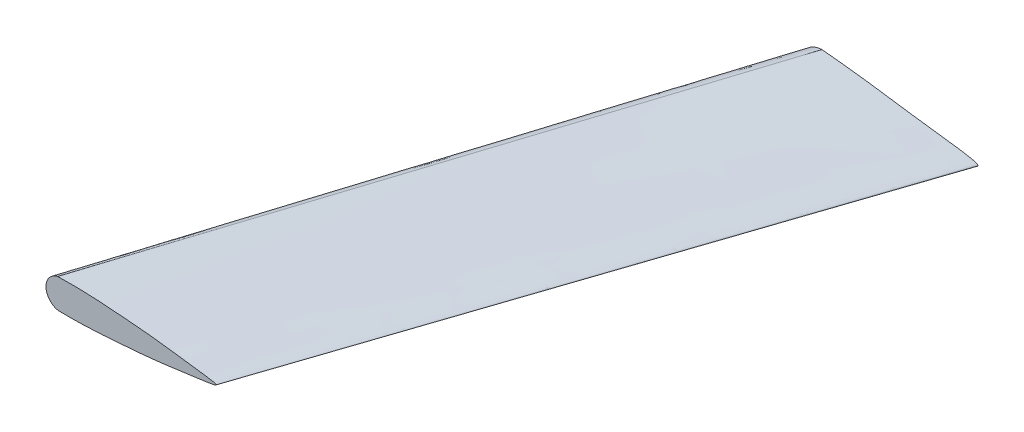
ISO-10303-21;
HEADER;
FILE_DESCRIPTION(('STEP AP214'),'2;1');
FILE_NAME('part.step','',(''),(''),'','','');
FILE_SCHEMA(('AUTOMOTIVE_DESIGN { 1 0 10303 214 1 1 1 1 }'));
ENDSEC;
DATA;
#1=APPLICATION_CONTEXT('core data for automotive mechanical design processes');
#2=APPLICATION_PROTOCOL_DEFINITION('international standard','automotive_design',2000,#1);
#3=PRODUCT_CONTEXT('',#1,'mechanical');
#4=PRODUCT('Part','Part','',(#3));
#5=PRODUCT_RELATED_PRODUCT_CATEGORY('part','',(#4));
#6=PRODUCT_DEFINITION_FORMATION('','',#4);
#7=PRODUCT_DEFINITION_CONTEXT('part definition',#1,'design');
#8=PRODUCT_DEFINITION('design','',#6,#7);
#9=PRODUCT_DEFINITION_SHAPE('','',#8);
#10=(LENGTH_UNIT() NAMED_UNIT(*) SI_UNIT(.MILLI.,.METRE.));
#11=(NAMED_UNIT(*) PLANE_ANGLE_UNIT() SI_UNIT($,.RADIAN.));
#12=(NAMED_UNIT(*) SI_UNIT($,.STERADIAN.) SOLID_ANGLE_UNIT());
#13=UNCERTAINTY_MEASURE_WITH_UNIT(LENGTH_MEASURE(1.E-05),#10,'distance_accuracy_value','');
#14=(GEOMETRIC_REPRESENTATION_CONTEXT(3) GLOBAL_UNCERTAINTY_ASSIGNED_CONTEXT((#13)) GLOBAL_UNIT_ASSIGNED_CONTEXT((#10,
#11,#12)) REPRESENTATION_CONTEXT('',''));
#15=CARTESIAN_POINT('',(0.,0.,0.));
#16=DIRECTION('',(0.,0.,1.));
#17=DIRECTION('',(1.,0.,0.));
#18=AXIS2_PLACEMENT_3D('',#15,#16,#17);
#19=CARTESIAN_POINT('',(-386.17135008712,24.2268414892815,766.353171626567));
#20=DIRECTION('',(0.,0.,1.));
#21=DIRECTION('',(1.,0.,0.));
#22=AXIS2_PLACEMENT_3D('',#19,#20,#21);
#23=PLANE('',#22);
#24=CARTESIAN_POINT('',(-355.842308478358,-13.5919026387807,766.353171626567));
#25=CARTESIAN_POINT('',(-358.147920916067,-13.0809082161954,766.353171626567));
#26=CARTESIAN_POINT('',(-362.799253796191,-11.5850758564931,766.353171626567));
#27=CARTESIAN_POINT('',(-368.126623336941,-8.6822798335398,766.353171626567));
#28=CARTESIAN_POINT('',(-372.108209031717,-5.70325993693681,766.353171626567));
#29=CARTESIAN_POINT('',(-374.862376744892,-3.19928868976864,766.353171626567));
#30=CARTESIAN_POINT('',(-377.366618804863,-0.44493632139839,766.353171626567));
#31=CARTESIAN_POINT('',(-379.600470197875,2.54116834156817,766.353171626567));
#32=CARTESIAN_POINT('',(-381.544903254115,5.73705852469849,766.353171626567));
#33=CARTESIAN_POINT('',(-383.180113713941,9.12813683828008,766.353171626567));
#34=CARTESIAN_POINT('',(-384.486712481758,12.6855603817283,766.353171626567));
#35=CARTESIAN_POINT('',(-385.445090832709,16.4062629041933,766.353171626567));
#36=CARTESIAN_POINT('',(-386.035753835176,20.2425914517185,766.353171626567));
#37=CARTESIAN_POINT('',(-386.239148218191,24.2268440568608,766.353171626567));
#38=CARTESIAN_POINT('',(-386.035753814777,28.2110967078324,766.353171626567));
#39=CARTESIAN_POINT('',(-385.445090884173,32.0474251889436,766.353171626567));
#40=CARTESIAN_POINT('',(-384.486712355592,35.768127842187,766.353171626567));
#41=CARTESIAN_POINT('',(-383.180113968863,39.3255511215188,766.353171626567));
#42=CARTESIAN_POINT('',(-381.544902768267,42.7166299394183,766.353171626567));
#43=CARTESIAN_POINT('',(-379.60047110225,45.91251918088,766.353171626567));
#44=CARTESIAN_POINT('',(-377.366617186236,48.8986255503425,766.353171626567));
#45=CARTESIAN_POINT('',(-374.862379166617,51.6529751869416,766.353171626567));
#46=CARTESIAN_POINT('',(-372.108209401964,54.1569478219396,766.353171626567));
#47=CARTESIAN_POINT('',(-368.126573732497,57.136001490939,766.353171626567));
#48=CARTESIAN_POINT('',(-362.799280092021,60.0387464062484,766.353171626567));
#49=CARTESIAN_POINT('',(-358.147927408527,61.5345930722951,766.353171626567));
#50=CARTESIAN_POINT('',(-355.842312196727,62.0455904675081,766.353171626567));
#51=B_SPLINE_CURVE_WITH_KNOTS('',3,(#24,#25,#26,#27,#28,#29,#30,#31,#32,#33,#34,#35,#36,#37,#38,
#39,#40,#41,#42,#43,#44,#45,#46,#47,#48,#49,#50),.UNSPECIFIED.,.F.,.F.,(4,1,1,1,1,1,1,1,1,1,1,1,
1,1,1,1,1,1,1,1,1,1,1,1,4),(0.0675033234996887,0.125,0.1875,0.21875,0.25,0.28125,0.3125,0.34375,
0.375,0.40625,0.4375,0.46875,0.5,0.53125,0.5625,0.59375,0.625,0.65625,0.6875,0.71875,0.75,
0.78125,0.8125,0.875,0.932496636103502),.UNSPECIFIED.);
#52=CARTESIAN_POINT('',(-355.842309230463,-13.591902326263,766.353171626567));
#53=VERTEX_POINT('',#52);
#54=CARTESIAN_POINT('',(-355.842312196727,62.0455904675081,766.353171626567));
#55=VERTEX_POINT('',#54);
#56=EDGE_CURVE('E71',#53,#55,#51,.T.);
#57=ORIENTED_EDGE('',*,*,#56,.F.);
#58=CARTESIAN_POINT('',(-355.842312196727,62.0455904675081,766.353171626567));
#59=CARTESIAN_POINT('',(-353.297481143165,62.1234537250533,766.353171626567));
#60=CARTESIAN_POINT('',(-331.895982275564,62.6908030841018,766.353171626567));
#61=CARTESIAN_POINT('',(-310.135971955694,62.5426455831257,766.353171626567));
#62=CARTESIAN_POINT('',(-272.083970484117,61.3961570997766,766.353171626568));
#63=CARTESIAN_POINT('',(-252.554697808675,60.353018714265,766.353171626568));
#64=CARTESIAN_POINT('',(-214.450855824515,57.8523002404734,766.353171626568));
#65=CARTESIAN_POINT('',(-194.838246279998,56.329737945447,766.353171626568));
#66=CARTESIAN_POINT('',(-156.959669835358,53.2468514511438,766.353171626568));
#67=CARTESIAN_POINT('',(-137.665791758024,51.6047157251566,766.353171626568));
#68=CARTESIAN_POINT('',(-98.9032615648933,47.6178447133553,766.353171626568));
#69=CARTESIAN_POINT('',(-78.3731384454902,45.1575816166672,766.353171626568));
#70=CARTESIAN_POINT('',(-42.9305350650487,40.2587091098047,766.353171626568));
#71=CARTESIAN_POINT('',(-27.0957667285709,37.692047097939,766.353171626568));
#72=CARTESIAN_POINT('',(20.8463634559503,31.6065898938472,766.353171626568));
#73=CARTESIAN_POINT('',(54.4472084766871,27.9100493798003,766.353171626568));
#74=CARTESIAN_POINT('',(55.3479610458814,20.6930341506973,766.353171626568));
#75=CARTESIAN_POINT('',(22.0865399761721,16.9887896595361,766.353171626568));
#76=CARTESIAN_POINT('',(-26.3334339596562,10.8734004836462,766.353171626568));
#77=CARTESIAN_POINT('',(-42.2572408418296,8.29844257218873,766.353171626568));
#78=CARTESIAN_POINT('',(-77.570779358455,3.3970582268412,766.353171626568));
#79=CARTESIAN_POINT('',(-98.0759664627907,0.930501027220816,766.353171626568));
#80=CARTESIAN_POINT('',(-136.870639280538,-3.07839043210632,766.353171626568));
#81=CARTESIAN_POINT('',(-156.17030993408,-4.72695871670605,766.353171626568));
#82=CARTESIAN_POINT('',(-194.039580846522,-7.8129243350639,766.353171626568));
#83=CARTESIAN_POINT('',(-213.650182655864,-9.3395689758605,766.353171626568));
#84=CARTESIAN_POINT('',(-251.755504762222,-11.8530979206023,766.353171626568));
#85=CARTESIAN_POINT('',(-271.284757505092,-12.9058291803733,766.353171626568));
#86=CARTESIAN_POINT('',(-309.33530982959,-14.0768612861094,766.353171626567));
#87=CARTESIAN_POINT('',(-328.894786935377,-14.2244630585918,766.353171626567));
#88=CARTESIAN_POINT('',(-350.564748997106,-13.7422435150846,766.353171626567));
#89=CARTESIAN_POINT('',(-353.37672316315,-13.6673409378978,766.353171626567));
#90=CARTESIAN_POINT('',(-355.842309230463,-13.591902326263,766.353171626567));
#91=B_SPLINE_CURVE_WITH_KNOTS('',3,(#58,#59,#60,#61,#62,#63,#64,#65,#66,#67,#68,#69,#70,#71,#72,
#73,#74,#75,#76,#77,#78,#79,#80,#81,#82,#83,#84,#85,#86,#87,#88,#89,#90),.UNSPECIFIED.,.F.,.F.,
(4,1,1,1,1,1,1,1,1,1,1,1,1,1,1,1,1,1,1,1,1,1,1,1,1,1,1,1,1,1,4),(0.147230760804553,
0.153748711982093,0.202038514845157,0.202924962495472,0.251275629360019,0.252162033516698,
0.300589425301991,0.301475790959182,0.349963868423673,0.350850410363611,0.399492351086492,
0.400378840750798,0.449147617509877,0.450034058565626,0.499113596493106,0.5,0.549079575476335,
0.549965941434374,0.59873484189972,0.599621159249202,0.64826332456254,0.64914958963639,
0.697637767684222,0.698524209040818,0.746951563626193,0.747837966483302,0.796188678141055,
0.797075037504528,0.845364976114569,0.846251288017907,0.852566272891533),.UNSPECIFIED.);
#92=EDGE_CURVE('E12',#55,#53,#91,.T.);
#93=ORIENTED_EDGE('',*,*,#92,.F.);
#94=EDGE_LOOP('',(#57,#93));
#95=FACE_BOUND('',#94,.T.);
#96=ADVANCED_FACE('F61',(#95),#23,.T.);
#97=CARTESIAN_POINT('',(89.9976521512201,24.226967560186,-713.584473013432));
#98=DIRECTION('',(0.,0.,-1.));
#99=DIRECTION('',(-1.,0.,0.));
#100=AXIS2_PLACEMENT_3D('',#97,#98,#99);
#101=PLANE('',#100);
#102=CARTESIAN_POINT('',(146.235776469784,82.6061359469882,-713.584473013432));
#103=CARTESIAN_POINT('',(144.460889129259,82.5398294956927,-713.584473013432));
#104=CARTESIAN_POINT('',(142.691498804594,82.3655444691674,-713.584473013432));
#105=CARTESIAN_POINT('',(139.834832413366,82.0841627012055,-713.584473013432));
#106=CARTESIAN_POINT('',(137.020482671301,81.5243286915221,-713.584473013432));
#107=CARTESIAN_POINT('',(134.205127570774,80.9642946946621,-713.584473013432));
#108=CARTESIAN_POINT('',(131.459227595661,80.1313068136255,-713.584473013432));
#109=CARTESIAN_POINT('',(128.712298972757,79.2980068851178,-713.584473013432));
#110=CARTESIAN_POINT('',(126.061291504144,78.1998943976652,-713.584473013432));
#111=CARTESIAN_POINT('',(123.409267769514,77.1013609478364,-713.584473013432));
#112=CARTESIAN_POINT('',(120.878659472122,75.7486920010241,-713.584473013432));
#113=CARTESIAN_POINT('',(118.347081064385,74.3955045076862,-713.584473013432));
#114=CARTESIAN_POINT('',(115.96124307918,72.8013060427455,-713.584473013432));
#115=CARTESIAN_POINT('',(113.574490481725,71.2064964409822,-713.584473013432));
#116=CARTESIAN_POINT('',(111.356399733315,69.3861214608127,-713.584473013432));
#117=CARTESIAN_POINT('',(109.137458678272,67.5650486386274,-713.584473013432));
#118=CARTESIAN_POINT('',(107.10847659321,65.5360283496795,-713.584473013432));
#119=CARTESIAN_POINT('',(105.078734414158,63.506247952429,-713.584473013432));
#120=CARTESIAN_POINT('',(103.258383480857,61.288105210681,-713.584473013432));
#121=CARTESIAN_POINT('',(101.437382261364,59.0691700790873,-713.584473013432));
#122=CARTESIAN_POINT('',(99.8431988976007,56.6832618657969,-713.584473013432));
#123=CARTESIAN_POINT('',(98.248446051899,54.2965013467648,-713.584473013432));
#124=CARTESIAN_POINT('',(96.8958129379092,51.7658454737018,-713.584473013432));
#125=CARTESIAN_POINT('',(95.5426731119657,49.2342415877827,-713.584473013432));
#126=CARTESIAN_POINT('',(94.4446105397792,46.5832134423848,-713.584473013432));
#127=CARTESIAN_POINT('',(93.3461270255399,43.9311690259132,-713.584473013432));
#128=CARTESIAN_POINT('',(92.5131981222679,41.1852773514223,-713.584473013432));
#129=CARTESIAN_POINT('',(91.6799571897824,38.4383570196041,-713.584473013432));
#130=CARTESIAN_POINT('',(91.1201762427735,35.6240222761823,-713.584473013432));
#131=CARTESIAN_POINT('',(90.5601904366851,32.8086575905513,-713.584473013432));
#132=CARTESIAN_POINT('',(90.2789604634988,29.9530061431307,-713.584473013432));
#133=CARTESIAN_POINT('',(89.9976251380542,27.0962849330349,-713.584473013432));
#134=CARTESIAN_POINT('',(89.9976521522534,24.2268439377215,-713.584473013432));
#135=CARTESIAN_POINT('',(89.9976791768086,21.3563029376077,-713.584473013432));
#136=CARTESIAN_POINT('',(90.2789604618535,18.5006817322315,-713.584473013432));
#137=CARTESIAN_POINT('',(90.5603495764839,15.6439658203568,-713.584473013432));
#138=CARTESIAN_POINT('',(91.120176239499,12.8296655989382,-713.584473013432));
#139=CARTESIAN_POINT('',(91.6802175121583,10.0142865150614,-713.584473013432));
#140=CARTESIAN_POINT('',(92.5131981173955,7.268410523298,-713.584473013432));
#141=CARTESIAN_POINT('',(93.3464980440662,4.52148190551634,-713.584473013432));
#142=CARTESIAN_POINT('',(94.4446105333559,1.8704744317806,-713.584473013432));
#143=CARTESIAN_POINT('',(95.5431343932931,-0.781526152107157,-713.584473013432));
#144=CARTESIAN_POINT('',(96.8958129299968,-3.31215760024068,-713.584473013432));
#145=CARTESIAN_POINT('',(98.2489864977841,-5.84371516732536,-713.584473013432));
#146=CARTESIAN_POINT('',(99.8431988882755,-8.22957399318263,-713.584473013432));
#147=CARTESIAN_POINT('',(101.43799456991,-10.6163057581355,-713.584473013432));
#148=CARTESIAN_POINT('',(103.258383470208,-12.834417339048,-713.584473013432));
#149=CARTESIAN_POINT('',(105.079422674788,-15.0533213041909,-713.584473013432));
#150=CARTESIAN_POINT('',(107.108476581341,-17.0823404791527,-713.584473013432));
#151=CARTESIAN_POINT('',(109.138237605474,-19.1120667595899,-713.584473013432));
#152=CARTESIAN_POINT('',(111.35639972034,-20.9324335915064,-713.584473013432));
#153=CARTESIAN_POINT('',(113.575334854644,-22.7534348130089,-713.584473013432));
#154=CARTESIAN_POINT('',(115.961243065224,-24.3476181747622,-713.584473013432));
#155=CARTESIAN_POINT('',(118.347982752238,-25.9423571010128,-713.584473013432));
#156=CARTESIAN_POINT('',(120.878659457319,-27.2950041344537,-713.584473013432));
#157=CARTESIAN_POINT('',(123.410240186151,-28.6481343687087,-713.584473013432));
#158=CARTESIAN_POINT('',(126.061291488636,-29.7462065325838,-713.584473013432));
#159=CARTESIAN_POINT('',(128.713312757442,-30.8446804589657,-713.584473013432));
#160=CARTESIAN_POINT('',(131.459227579599,-31.677618950095,-713.584473013432));
#161=CARTESIAN_POINT('',(134.2061233313,-32.5108549937807,-713.584473013432));
#162=CARTESIAN_POINT('',(137.020482654839,-33.0706408295894,-713.584473013432));
#163=CARTESIAN_POINT('',(139.835847340931,-33.6306266354988,-713.584473013432));
#164=CARTESIAN_POINT('',(142.69149878789,-33.9118566088641,-713.584473013432));
#165=CARTESIAN_POINT('',(144.461092102465,-34.0861295164542,-713.584473013432));
#166=CARTESIAN_POINT('',(146.235777711773,-34.1524388655363,-713.584473013432));
#167=B_SPLINE_CURVE_WITH_KNOTS('',2,(#102,#103,#104,#105,#106,#107,#108,#109,#110,#111,#112,
#113,#114,#115,#116,#117,#118,#119,#120,#121,#122,#123,#124,#125,#126,#127,#128,#129,#130,#131,
#132,#133,#134,#135,#136,#137,#138,#139,#140,#141,#142,#143,#144,#145,#146,#147,#148,#149,#150,
#151,#152,#153,#154,#155,#156,#157,#158,#159,#160,#161,#162,#163,#164,#165,#166),.UNSPECIFIED.,
.F.,.F.,(3,2,2,2,2,2,2,2,2,2,2,2,2,2,2,2,2,2,2,2,2,2,2,2,2,2,2,2,2,2,2,2,3),(0.0118903573855967,
0.0312513463257155,0.0625013463257155,0.0937513463257155,0.125001346325716,0.156251346325716,
0.187501346325716,0.218751346325716,0.250001346325716,0.281251346325716,0.312501346325716,
0.343751346325716,0.375001346325716,0.406251346325716,0.437501346325716,0.468751346325716,
0.500001346325715,0.531251346325715,0.562501346325715,0.593751346325715,0.625001346325715,
0.656251346325715,0.687501346325715,0.718751346325715,0.750001346325715,0.781251346325715,
0.812501346325715,0.843751346325715,0.875001346325715,0.906251346325715,0.937501346325715,
0.968751346325715,0.988110988940119),.UNSPECIFIED.);
#168=CARTESIAN_POINT('',(146.235776469784,82.6061359469882,-713.584473013432));
#169=VERTEX_POINT('',#168);
#170=CARTESIAN_POINT('',(146.235777711773,-34.1524388655364,-713.584473013432));
#171=VERTEX_POINT('',#170);
#172=EDGE_CURVE('E96',#169,#171,#167,.T.);
#173=ORIENTED_EDGE('',*,*,#172,.F.);
#174=CARTESIAN_POINT('',(146.235777711773,-34.1524388655364,-713.584473013432));
#175=CARTESIAN_POINT('',(152.302627039209,-33.5586726279503,-713.584473013432));
#176=CARTESIAN_POINT('',(159.165044964761,-32.8720833554528,-713.584473013432));
#177=CARTESIAN_POINT('',(208.79605817704,-27.7701582932685,-713.584473013432));
#178=CARTESIAN_POINT('',(254.417695405181,-22.3055110300231,-713.584473013432));
#179=CARTESIAN_POINT('',(333.201231631873,-11.4215222759104,-713.584473013432));
#180=CARTESIAN_POINT('',(368.359816417048,-5.72098021429966,-713.584473013432));
#181=CARTESIAN_POINT('',(474.752100935122,7.7919933963154,-713.584473013432));
#182=CARTESIAN_POINT('',(549.500034653991,16.0030630971905,-713.584473013432));
#183=CARTESIAN_POINT('',(551.986836456988,32.0381748557836,-713.584473013432));
#184=CARTESIAN_POINT('',(478.175989388422,40.2705260136545,-713.584473013432));
#185=CARTESIAN_POINT('',(370.464680596076,53.8661052732924,-713.584473013432));
#186=CARTESIAN_POINT('',(335.059998100695,59.5895858504832,-713.584473013432));
#187=CARTESIAN_POINT('',(256.633100380444,70.4804662235494,-713.584473013432));
#188=CARTESIAN_POINT('',(211.07988958148,75.9625401313713,-713.584473013432));
#189=CARTESIAN_POINT('',(160.650956891497,81.1767117481631,-713.584473013432));
#190=CARTESIAN_POINT('',(153.042645526978,81.9399435788635,-713.584473013432));
#191=CARTESIAN_POINT('',(146.235776469784,82.6061359469882,-713.584473013432));
#192=B_SPLINE_CURVE_WITH_KNOTS('',3,(#174,#175,#176,#177,#178,#179,#180,#181,#182,#183,#184,
#185,#186,#187,#188,#189,#190,#191),.UNSPECIFIED.,.F.,.F.,(4,1,1,1,1,1,1,1,1,1,1,1,1,1,1,4),
(0.342153849510705,0.349114789646846,0.350001054720696,0.398643220034033,0.399529537383515,
0.448298437848861,0.4491848038069,0.498264379283235,0.499150782790129,0.54823032071761,
0.549116761773358,0.597885538532437,0.598772028196743,0.647413968919625,0.648300510859562,
0.65611052977253),.UNSPECIFIED.);
#193=EDGE_CURVE('E93',#171,#169,#192,.T.);
#194=ORIENTED_EDGE('',*,*,#193,.F.);
#195=EDGE_LOOP('',(#173,#194));
#196=FACE_BOUND('',#195,.T.);
#197=ADVANCED_FACE('F95',(#196),#101,.T.);
#198=CARTESIAN_POINT('',(146.235776469784,82.6061359469882,-713.584473013432));
#199=CARTESIAN_POINT('',(-355.842312196727,62.0455904675081,766.353171626567));
#200=CARTESIAN_POINT('',(145.052518242767,82.5619316461245,-713.584473013432));
#201=CARTESIAN_POINT('',(-356.530230234453,61.8931260304247,766.353171626567));
#202=CARTESIAN_POINT('',(143.870997258025,82.4817251198566,-713.584473013432));
#203=CARTESIAN_POINT('',(-357.211301555715,61.7223460506264,766.353171626567));
#204=CARTESIAN_POINT('',(140.786959447429,82.1779472568651,-713.584473013432));
#205=CARTESIAN_POINT('',(-358.972341135433,61.2294556261105,766.353171626567));
#206=CARTESIAN_POINT('',(138.896548272934,81.8975180334483,-713.584473013432));
#207=CARTESIAN_POINT('',(-360.040440130116,60.8788157590375,766.353171626567));
#208=CARTESIAN_POINT('',(136.162523683801,81.3536624047643,-713.584473013432));
#209=CARTESIAN_POINT('',(-361.565164093417,60.3038243244367,766.353171626567));
#210=CARTESIAN_POINT('',(134.296379164275,80.9387606650345,-713.584473013432));
#211=CARTESIAN_POINT('',(-362.60184388045,59.8890500101071,766.353171626567));
#212=CARTESIAN_POINT('',(132.453047352178,80.4327889581378,-713.584473013432));
#213=CARTESIAN_POINT('',(-363.615906450397,59.431298054129,766.353171626567));
#214=CARTESIAN_POINT('',(129.62777040576,79.5757215200419,-713.584473013432));
#215=CARTESIAN_POINT('',(-365.160729126971,58.68995232469,766.353171626567));
#216=CARTESIAN_POINT('',(127.828460438883,78.9318992289042,-713.584473013432));
#217=CARTESIAN_POINT('',(-366.138058024704,58.1677495695087,766.353171626567));
#218=CARTESIAN_POINT('',(124.798480176051,77.6768068903333,-713.584473013432));
#219=CARTESIAN_POINT('',(-367.768744376833,57.2048644562379,766.353171626567));
#220=CARTESIAN_POINT('',(123.059467731217,76.8839868011184,-713.584473013432));
#221=CARTESIAN_POINT('',(-368.70151739809,56.6148858078268,766.353171626567));
#222=CARTESIAN_POINT('',(121.36059603607,76.0062982947588,-713.584473013432));
#223=CARTESIAN_POINT('',(-369.606734149297,55.9869578028287,766.353171626567));
#224=CARTESIAN_POINT('',(119.456222506887,74.9883663853787,-713.584473013432));
#225=CARTESIAN_POINT('',(-370.619229569484,55.2662588799354,766.353171626567));
#226=CARTESIAN_POINT('',(117.809500246656,74.0185563722649,-713.584473013432));
#227=CARTESIAN_POINT('',(-371.492543658088,54.5962624914552,766.353171626567));
#228=CARTESIAN_POINT('',(116.211044006836,72.9682210880587,-713.584473013432));
#229=CARTESIAN_POINT('',(-372.33549277115,53.8909777927138,766.353171626567));
#230=CARTESIAN_POINT('',(114.415615331313,71.7685295515084,-713.584473013432));
#231=CARTESIAN_POINT('',(-373.281385785697,53.0887998106383,766.353171626567));
#232=CARTESIAN_POINT('',(112.879071936413,70.6322860834025,-713.584473013432));
#233=CARTESIAN_POINT('',(-374.089697429861,52.3440865519937,766.353171626567));
#234=CARTESIAN_POINT('',(111.398455004714,69.420635992688,-713.584473013432));
#235=CARTESIAN_POINT('',(-374.865305161902,51.5666111187928,766.353171626567));
#236=CARTESIAN_POINT('',(109.876963978847,68.1719566056865,-713.584473013432));
#237=CARTESIAN_POINT('',(-375.662221727239,50.7658386909427,766.353171626567));
#238=CARTESIAN_POINT('',(108.461004634253,66.8885818575943,-713.584473013432));
#239=CARTESIAN_POINT('',(-376.404116153992,49.9547238705909,766.353171626568));
#240=CARTESIAN_POINT('',(106.972987975218,65.40053718056,-713.584473013432));
#241=CARTESIAN_POINT('',(-377.181447170624,49.029015527272,766.353171626568));
#242=CARTESIAN_POINT('',(105.627026718976,64.0413074910817,-713.584473013432));
#243=CARTESIAN_POINT('',(-377.884688678356,48.1843094081699,766.353171626567));
#244=CARTESIAN_POINT('',(104.350627481286,62.6190316037461,-713.584473013432));
#245=CARTESIAN_POINT('',(-378.552550054754,47.309277602251,766.353171626567));
#246=CARTESIAN_POINT('',(102.980765985821,60.949821410382,-713.584473013432));
#247=CARTESIAN_POINT('',(-379.268329604605,46.293250069074,766.353171626567));
#248=CARTESIAN_POINT('',(101.784207882246,59.4580176746399,-713.584473013432));
#249=CARTESIAN_POINT('',(-379.894019020979,45.386581238582,766.353171626567));
#250=CARTESIAN_POINT('',(100.663052435893,57.9102821290677,-713.584473013432));
#251=CARTESIAN_POINT('',(-380.481837138414,44.4524620311487,766.353171626567));
#252=CARTESIAN_POINT('',(99.4633879317363,56.1148240539668,-713.584473013432));
#253=CARTESIAN_POINT('',(-381.11072239589,43.3754608578863,766.353171626567));
#254=CARTESIAN_POINT('',(98.4291606533595,54.5067018663556,-713.584473013432));
#255=CARTESIAN_POINT('',(-381.653800650637,42.411834808553,766.353171626567));
#256=CARTESIAN_POINT('',(97.4754605865713,52.8503145076344,-713.584473013432));
#257=CARTESIAN_POINT('',(-382.156416982765,41.4226679350468,766.353171626567));
#258=CARTESIAN_POINT('',(96.4575600896247,50.945913495897,-713.584473013432));
#259=CARTESIAN_POINT('',(-382.693253845986,40.2893335628557,766.353171626567));
#260=CARTESIAN_POINT('',(95.5968515597989,49.2390026788573,-713.584473013432));
#261=CARTESIAN_POINT('',(-383.148573838211,39.2737684366084,766.353171626567));
#262=CARTESIAN_POINT('',(94.8210141722245,47.4919563946698,-713.584473013432));
#263=CARTESIAN_POINT('',(-383.560894392386,38.2364369091058,766.353171626567));
#264=CARTESIAN_POINT('',(93.9946826940945,45.496962610674,-713.584473013432));
#265=CARTESIAN_POINT('',(-384.000593627495,37.0531879369522,766.353171626567));
#266=CARTESIAN_POINT('',(93.3167948630052,43.7098482797074,-713.584473013432));
#267=CARTESIAN_POINT('',(-384.363065875953,35.99149742103,766.353171626567));
#268=CARTESIAN_POINT('',(92.7273030736939,41.8911107080009,-713.584473013432));
#269=CARTESIAN_POINT('',(-384.679973077686,34.9084415747646,766.353171626567));
#270=CARTESIAN_POINT('',(92.1004969293997,39.8247377362192,-713.584473013432));
#271=CARTESIAN_POINT('',(-385.017412260293,33.6777440387396,766.353171626567));
#272=CARTESIAN_POINT('',(91.6127519361506,37.9768536751234,-713.584473013432));
#273=CARTESIAN_POINT('',(-385.281911166334,32.5729811210065,766.353171626567));
#274=CARTESIAN_POINT('',(91.2160741233449,36.1061550435702,-713.584473013432));
#275=CARTESIAN_POINT('',(-385.498293981316,31.4530884048829,766.353171626567));
#276=CARTESIAN_POINT('',(90.7948225402501,33.988285594172,-713.584473013432));
#277=CARTESIAN_POINT('',(-385.72836503318,30.1845202044005,766.353171626568));
#278=CARTESIAN_POINT('',(90.5024902740094,32.0997123437652,-713.584473013432));
#279=CARTESIAN_POINT('',(-385.889786583449,29.0464651988698,766.353171626567));
#280=CARTESIAN_POINT('',(90.3030249168464,30.1973602219478,-713.584473013432));
#281=CARTESIAN_POINT('',(-386.000533515016,27.8890541125367,766.353171626567));
#282=CARTESIAN_POINT('',(90.0913901973952,28.0483894487484,-713.584473013432));
#283=CARTESIAN_POINT('',(-386.118123580519,26.5803251143115,766.353171626567));
#284=CARTESIAN_POINT('',(89.9976362324306,26.1396637757376,-713.584473013432));
#285=CARTESIAN_POINT('',(-386.171351269524,25.4035583790201,766.353171626567));
#286=CARTESIAN_POINT('',(89.9976521570302,24.2263365464082,-713.584473013432));
#287=CARTESIAN_POINT('',(-386.171350087094,24.2267916497255,766.353171626567));
#288=CARTESIAN_POINT('',(89.9976701703495,22.3129666035122,-713.584473013432));
#289=CARTESIAN_POINT('',(-386.171347719169,23.0499987130527,766.353171626568));
#290=CARTESIAN_POINT('',(90.0914575767545,20.4042467513992,-713.584473013432));
#291=CARTESIAN_POINT('',(-386.118116530265,21.8732323717211,766.353171626567));
#292=CARTESIAN_POINT('',(90.3031276577641,18.2553317541631,-713.584473013432));
#293=CARTESIAN_POINT('',(-386.000523656057,20.56453092359,766.353171626567));
#294=CARTESIAN_POINT('',(90.5026238282284,16.3529905350336,-713.584473013432));
#295=CARTESIAN_POINT('',(-385.889774461327,19.4071206982511,766.353171626567));
#296=CARTESIAN_POINT('',(90.7949862546924,14.4644256178967,-713.584473013432));
#297=CARTESIAN_POINT('',(-385.728350635822,18.2690665390274,766.353171626567));
#298=CARTESIAN_POINT('',(91.2162759022508,12.3465637389721,-713.584473013432));
#299=CARTESIAN_POINT('',(-385.498274689501,17.0004999549103,766.353171626567));
#300=CARTESIAN_POINT('',(91.6129837940677,10.475870253683,-713.584473013432));
#301=CARTESIAN_POINT('',(-385.281889738587,15.8806079155581,766.353171626567));
#302=CARTESIAN_POINT('',(92.1007604519235,8.62798921768549,-713.584473013432));
#303=CARTESIAN_POINT('',(-385.017388729262,14.7758457003993,766.353171626567));
#304=CARTESIAN_POINT('',(92.7276082396479,6.56161902853557,-713.584473013432));
#305=CARTESIAN_POINT('',(-384.679944891997,13.5451501093504,766.353171626567));
#306=CARTESIAN_POINT('',(93.3171316767366,4.74288618531729,-713.584473013432));
#307=CARTESIAN_POINT('',(-384.36303565889,12.4620952149667,766.353171626567));
#308=CARTESIAN_POINT('',(93.9950477500452,2.95578610075261,-713.584473013432));
#309=CARTESIAN_POINT('',(-384.00056130595,11.4004055992537,766.353171626567));
#310=CARTESIAN_POINT('',(94.8214131846645,0.960816582985141,-713.584473013432));
#311=CARTESIAN_POINT('',(-383.560857577924,10.2171587606348,766.353171626567));
#312=CARTESIAN_POINT('',(95.5972759282088,-0.786209452615297,-713.584473013432));
#313=CARTESIAN_POINT('',(-383.148535086112,9.17982818639334,766.353171626567));
#314=CARTESIAN_POINT('',(96.4580079642971,-2.49309898114819,-713.584473013432));
#315=CARTESIAN_POINT('',(-382.693213303046,8.16426411395781,766.353171626567));
#316=CARTESIAN_POINT('',(97.4759382426203,-4.39747337937669,-713.584473013432));
#317=CARTESIAN_POINT('',(-382.156372347018,7.03093217531563,766.353171626567));
#318=CARTESIAN_POINT('',(98.4296603283874,-6.05383851395138,-713.584473013432));
#319=CARTESIAN_POINT('',(-381.653754296025,6.04176649649093,766.353171626567));
#320=CARTESIAN_POINT('',(99.4639084087603,-7.66193724445806,-713.584473013432));
#321=CARTESIAN_POINT('',(-381.110674043569,5.07814145262983,766.353171626567));
#322=CARTESIAN_POINT('',(100.66359994735,-9.45736592304787,-713.584473013432));
#323=CARTESIAN_POINT('',(-380.481784568407,4.00114275083514,766.353171626567));
#324=CARTESIAN_POINT('',(101.784776515222,-11.0050799461803,-713.584473013432));
#325=CARTESIAN_POINT('',(-379.89396453637,3.06702461168814,766.353171626567));
#326=CARTESIAN_POINT('',(102.981356421885,-12.496864795187,-713.584473013432));
#327=CARTESIAN_POINT('',(-379.268273717445,2.16035719599839,766.353171626567));
#328=CARTESIAN_POINT('',(104.351246490207,-14.1660515412858,-713.584473013432));
#329=CARTESIAN_POINT('',(-378.552490792124,1.14433273891445,766.353171626567));
#330=CARTESIAN_POINT('',(105.627670154266,-15.5883105256014,-713.584473013432));
#331=CARTESIAN_POINT('',(-377.884628388788,0.269302655063031,766.353171626567));
#332=CARTESIAN_POINT('',(106.973658289293,-16.9475244948076,-713.584473013432));
#333=CARTESIAN_POINT('',(-377.181384995294,-0.575402322724923,766.353171626567));
#334=CARTESIAN_POINT('',(108.46176845036,-18.4356091836901,-713.584473013432));
#335=CARTESIAN_POINT('',(-376.404018636465,-1.5011454452934,766.353171626567));
#336=CARTESIAN_POINT('',(109.877753813669,-19.7189614351597,-713.584473013432));
#337=CARTESIAN_POINT('',(-375.662120091406,-2.31225818795364,766.353171626567));
#338=CARTESIAN_POINT('',(111.399201403261,-20.9675594118503,-713.584473013432));
#339=CARTESIAN_POINT('',(-374.865234679695,-3.11299318273196,766.353171626567));
#340=CARTESIAN_POINT('',(112.879837620297,-22.1791862494787,-713.584473013432));
#341=CARTESIAN_POINT('',(-374.089625174407,-3.89046737058992,766.353171626567));
#342=CARTESIAN_POINT('',(114.416398945404,-23.3154054595378,-713.584473013432));
#343=CARTESIAN_POINT('',(-373.281312554119,-4.63517884483606,766.353171626567));
#344=CARTESIAN_POINT('',(116.211849182567,-24.5150647264988,-713.584473013432));
#345=CARTESIAN_POINT('',(-372.335421492006,-5.43734990955738,766.353171626567));
#346=CARTESIAN_POINT('',(117.81032272912,-25.5653751776642,-713.584473013432));
#347=CARTESIAN_POINT('',(-371.492476135415,-6.1426295836749,766.353171626567));
#348=CARTESIAN_POINT('',(119.457064531726,-26.5351614587783,-713.584473013432));
#349=CARTESIAN_POINT('',(-370.619170439285,-6.81261781475734,766.353171626567));
#350=CARTESIAN_POINT('',(121.361464668782,-27.5530635838112,-713.584473013432));
#351=CARTESIAN_POINT('',(-369.606679109805,-7.53330830508074,766.353171626567));
#352=CARTESIAN_POINT('',(123.060356753461,-28.4307284945262,-713.584473013432));
#353=CARTESIAN_POINT('',(-368.701466052146,-8.16123129429719,766.353171626567));
#354=CARTESIAN_POINT('',(124.79938469437,-29.2235215423348,-713.584473013432));
#355=CARTESIAN_POINT('',(-367.768689427668,-8.75120985807963,766.353171626567));
#356=CARTESIAN_POINT('',(127.829467328894,-30.4785894439229,-713.584473013432));
#357=CARTESIAN_POINT('',(-366.137948215994,-9.71411970994971,766.353171626567));
#358=CARTESIAN_POINT('',(129.628781186419,-31.1223762147682,-713.584473013432));
#359=CARTESIAN_POINT('',(-365.160608501475,-10.2363246546156,766.353171626567));
#360=CARTESIAN_POINT('',(132.453967309586,-31.9793606512855,-713.584473013432));
#361=CARTESIAN_POINT('',(-363.615816196965,-10.9776506419985,766.353171626567));
#362=CARTESIAN_POINT('',(134.297295463495,-32.4853001867421,-713.584473013432));
#363=CARTESIAN_POINT('',(-362.601746341352,-11.4354049265833,766.353171626567));
#364=CARTESIAN_POINT('',(136.163442523367,-32.9001725733491,-713.584473013432));
#365=CARTESIAN_POINT('',(-361.565063560396,-11.8501786691256,766.353171626567));
#366=CARTESIAN_POINT('',(138.897560005993,-33.4439980285458,-713.584473013432));
#367=CARTESIAN_POINT('',(-360.040289321093,-12.4251825521773,766.353171626567));
#368=CARTESIAN_POINT('',(140.787832584133,-33.7243799487314,-713.584473013432));
#369=CARTESIAN_POINT('',(-358.972190966465,-12.7758167345888,766.353171626567));
#370=CARTESIAN_POINT('',(143.871329091823,-34.028048536035,-713.584473013432));
#371=CARTESIAN_POINT('',(-357.211199979223,-13.2686843091447,766.353171626567));
#372=CARTESIAN_POINT('',(145.052653972235,-34.1082326328149,-713.584473013432));
#373=CARTESIAN_POINT('',(-356.530177368664,-13.4394497977623,766.353171626567));
#374=CARTESIAN_POINT('',(146.235777711773,-34.1524388655363,-713.584473013432));
#375=CARTESIAN_POINT('',(-355.842308478358,-13.5919026387807,766.353171626567));
#376=B_SPLINE_SURFACE_WITH_KNOTS('',3,1,((#198,#199),(#200,#201),(#202,#203),(#204,#205),(#206,
#207),(#208,#209),(#210,#211),(#212,#213),(#214,#215),(#216,#217),(#218,#219),(#220,#221),(#222,
#223),(#224,#225),(#226,#227),(#228,#229),(#230,#231),(#232,#233),(#234,#235),(#236,#237),(#238,
#239),(#240,#241),(#242,#243),(#244,#245),(#246,#247),(#248,#249),(#250,#251),(#252,#253),(#254,
#255),(#256,#257),(#258,#259),(#260,#261),(#262,#263),(#264,#265),(#266,#267),(#268,#269),(#270,
#271),(#272,#273),(#274,#275),(#276,#277),(#278,#279),(#280,#281),(#282,#283),(#284,#285),(#286,
#287),(#288,#289),(#290,#291),(#292,#293),(#294,#295),(#296,#297),(#298,#299),(#300,#301),(#302,
#303),(#304,#305),(#306,#307),(#308,#309),(#310,#311),(#312,#313),(#314,#315),(#316,#317),(#318,
#319),(#320,#321),(#322,#323),(#324,#325),(#326,#327),(#328,#329),(#330,#331),(#332,#333),(#334,
#335),(#336,#337),(#338,#339),(#340,#341),(#342,#343),(#344,#345),(#346,#347),(#348,#349),(#350,
#351),(#352,#353),(#354,#355),(#356,#357),(#358,#359),(#360,#361),(#362,#363),(#364,#365),(#366,
#367),(#368,#369),(#370,#371),(#372,#373),(#374,#375)),.UNSPECIFIED.,.F.,.F.,.F.,(4,2,2,1,2,2,1,
2,1,2,1,2,2,1,2,1,2,1,2,1,2,1,2,1,2,1,2,1,2,2,1,2,1,2,1,2,1,2,1,2,1,2,1,2,2,1,2,1,2,1,2,2,1,2,2,
4),(2,2),(0.,0.0198325955366141,0.0518438018048507,0.0664706134321722,0.0838550080730873,
0.115866214341324,0.138725507301654,0.14787742060956,0.174852954236395,0.179888626877797,
0.210980401171136,0.211899833146034,0.24391103941427,0.247107848105877,0.275922245682507,
0.283235295040618,0.307933451950743,0.319362741975358,0.33994465821898,0.355490188910099,
0.371955864487217,0.39161763584484,0.403967070755453,0.427745082779581,0.43597827702369,
0.463872529714322,0.467989483291926,0.499999976649063,0.500000689560163,0.532011895828399,
0.536127423583804,0.564023102096636,0.572254870518545,0.596034308364873,0.608382317453285,
0.628045514633109,0.644509764388026,0.660056720901346,0.680637211322767,0.692067927169582,
0.716764658257508,0.724079133437819,0.752892105192249,0.756090339706056,0.788101545974292,
0.78901955212699,0.820112752242529,0.825146999061731,0.852123958510765,0.861274445996472,
0.884135164779002,0.916146371047239,0.933529339865953,0.948157577315475,0.980168783583712,1.),
(0.,1.),.UNSPECIFIED.);
#377=DIRECTION('',(-0.321243516648339,0.0131552026334751,0.946905245341413));
#378=VECTOR('',#377,1.);
#379=CARTESIAN_POINT('',(-104.803265383292,-23.8721707521585,26.3843493065675));
#380=LINE('',#379,#378);
#381=EDGE_CURVE('E79',#171,#53,#380,.T.);
#382=DIRECTION('',(0.321243518044265,0.0131552085459049,-0.946905244785695));
#383=VECTOR('',#382,1.);
#384=CARTESIAN_POINT('',(-104.803267863472,72.3258632072481,26.3843493065675));
#385=LINE('',#384,#383);
#386=EDGE_CURVE('E101',#55,#169,#385,.T.);
#387=ORIENTED_EDGE('',*,*,#172,.T.);
#388=ORIENTED_EDGE('',*,*,#381,.T.);
#389=ORIENTED_EDGE('',*,*,#56,.T.);
#390=ORIENTED_EDGE('',*,*,#386,.T.);
#391=EDGE_LOOP('',(#387,#388,#389,#390));
#392=FACE_BOUND('',#391,.T.);
#393=ADVANCED_FACE('F106',(#392),#376,.T.);
#394=CARTESIAN_POINT('',(146.235777711773,-34.1524388655364,-713.584473013432));
#395=CARTESIAN_POINT('',(-355.842309230463,-13.591902326263,766.353171626567));
#396=CARTESIAN_POINT('',(170.169163202191,-31.8100638553188,-713.584473013432));
#397=CARTESIAN_POINT('',(-331.591987587464,-14.3338803170939,766.353171626568));
#398=CARTESIAN_POINT('',(206.303303629178,-27.9479380252657,-713.584473013434));
#399=CARTESIAN_POINT('',(-294.908636911503,-14.0219870288041,766.353171626564));
#400=CARTESIAN_POINT('',(243.889566652419,-23.3928806246991,-713.584473013434));
#401=CARTESIAN_POINT('',(-256.75784485962,-12.0917741349592,766.353171626568));
#402=CARTESIAN_POINT('',(271.227277594095,-19.9273402730656,-713.584473013432));
#403=CARTESIAN_POINT('',(-229.007860211266,-10.3974730725951,766.35317162657));
#404=CARTESIAN_POINT('',(289.050763098436,-17.5549917130935,-713.584473013431));
#405=CARTESIAN_POINT('',(-210.913620045339,-9.0970053851929,766.353171626571));
#406=CARTESIAN_POINT('',(305.346427939713,-15.2491670334641,-713.584473013435));
#407=CARTESIAN_POINT('',(-194.358175927289,-7.8101209632751,766.35317162657));
#408=CARTESIAN_POINT('',(317.575875036262,-13.5011350041518,-713.584473013439));
#409=CARTESIAN_POINT('',(-181.932029212976,-6.8334753942839,766.353171626568));
#410=CARTESIAN_POINT('',(327.115096303082,-12.1054802892992,-713.584473013435));
#411=CARTESIAN_POINT('',(-172.237575530552,-6.04175497410459,766.353171626567));
#412=CARTESIAN_POINT('',(340.785819187038,-10.1072440719556,-713.58447301343));
#413=CARTESIAN_POINT('',(-158.346852149242,-4.88262676718666,766.353171626566));
#414=CARTESIAN_POINT('',(351.819272218584,-8.49515420936518,-713.584473013426));
#415=CARTESIAN_POINT('',(-147.137496419991,-3.92754049022599,766.353171626566));
#416=CARTESIAN_POINT('',(364.752255161391,-6.63031938727962,-713.584473013427));
#417=CARTESIAN_POINT('',(-134.008994800935,-2.7256955637152,766.353171626567));
#418=CARTESIAN_POINT('',(386.457437790551,-3.57227094816361,-713.58447301343));
#419=CARTESIAN_POINT('',(-112.000957680645,-0.551367236725745,766.35317162657));
#420=CARTESIAN_POINT('',(408.033780787271,-0.669608828441889,-713.584473013435));
#421=CARTESIAN_POINT('',(-90.1693968332287,1.87475167866653,766.353171626573));
#422=CARTESIAN_POINT('',(427.731087037273,1.82171819953336,-713.584473013432));
#423=CARTESIAN_POINT('',(-70.3013774701471,4.43085846259079,766.353171626567));
#424=CARTESIAN_POINT('',(436.248183820752,2.8760153964101,-713.584473013429));
#425=CARTESIAN_POINT('',(-61.7216813402665,5.59710545416991,766.353171626565));
#426=CARTESIAN_POINT('',(442.707282378885,3.67589358021684,-713.584473013428));
#427=CARTESIAN_POINT('',(-55.2167011201958,6.49352584049718,766.353171626565));
#428=CARTESIAN_POINT('',(453.938225426333,5.0711965557989,-713.584473013434));
#429=CARTESIAN_POINT('',(-43.916694908468,8.1327480123826,766.353171626566));
#430=CARTESIAN_POINT('',(463.425052988062,6.26328441941246,-713.584473013434));
#431=CARTESIAN_POINT('',(-34.3725414624667,9.53621221351924,766.353171626568));
#432=CARTESIAN_POINT('',(474.726305813606,7.70866737869243,-713.584473013434));
#433=CARTESIAN_POINT('',(-22.99431231258,11.1704222197833,766.353171626569));
#434=CARTESIAN_POINT('',(485.743024451646,9.15145123006648,-713.584473013432));
#435=CARTESIAN_POINT('',(-11.8882070529759,12.6938563115961,766.353171626568));
#436=CARTESIAN_POINT('',(496.745204068289,10.7025574582319,-713.584473013432));
#437=CARTESIAN_POINT('',(-0.767770259889052,14.1083152312959,766.353171626568));
#438=CARTESIAN_POINT('',(502.741763937737,11.5883947867023,-713.584473013432));
#439=CARTESIAN_POINT('',(5.30194608048057,14.8572373218164,766.353171626569));
#440=CARTESIAN_POINT('',(508.99152417245,12.5259473875812,-713.584473013433));
#441=CARTESIAN_POINT('',(11.6302222717486,15.637062252635,766.353171626569));
#442=CARTESIAN_POINT('',(516.737015310312,13.7707885410671,-713.584473013434));
#443=CARTESIAN_POINT('',(19.4835249938176,16.6199755191819,766.353171626567));
#444=CARTESIAN_POINT('',(524.923806953185,15.2494580890635,-713.584473013432));
#445=CARTESIAN_POINT('',(27.8011146560296,17.7439527015424,766.353171626566));
#446=CARTESIAN_POINT('',(529.683893027341,16.1831083517388,-713.58447301343));
#447=CARTESIAN_POINT('',(32.6466794168712,18.4328548659091,766.353171626567));
#448=CARTESIAN_POINT('',(533.649977107254,17.0407145667815,-713.584473013431));
#449=CARTESIAN_POINT('',(36.6929122873017,19.0565064189341,766.353171626567));
#450=CARTESIAN_POINT('',(537.23330460858,17.8776318427772,-713.584473013433));
#451=CARTESIAN_POINT('',(40.3567413525504,19.6561653340793,766.353171626566));
#452=CARTESIAN_POINT('',(540.412266635993,18.694206469929,-713.584473013433));
#453=CARTESIAN_POINT('',(43.6150082953196,20.2393452761655,766.353171626566));
#454=CARTESIAN_POINT('',(543.126666393484,19.5270653300402,-713.584473013434));
#455=CARTESIAN_POINT('',(46.4208990190179,20.8172697203866,766.353171626568));
#456=CARTESIAN_POINT('',(545.425892422373,20.3034687470982,-713.584473013433));
#457=CARTESIAN_POINT('',(48.8073821163783,21.3572586428133,766.353171626569));
#458=CARTESIAN_POINT('',(547.111877270178,20.9694652052098,-713.584473013433));
#459=CARTESIAN_POINT('',(50.5780796226478,21.8085576708509,766.353171626567));
#460=CARTESIAN_POINT('',(548.771624266207,21.8625365258923,-713.584473013431));
#461=CARTESIAN_POINT('',(52.3735652017525,22.4205690570588,766.353171626567));
#462=CARTESIAN_POINT('',(549.529754103494,22.3675322551913,-713.584473013432));
#463=CARTESIAN_POINT('',(53.2347151922459,22.752720936927,766.353171626568));
#464=CARTESIAN_POINT('',(549.996162961525,22.7785086085604,-713.584473013433));
#465=CARTESIAN_POINT('',(53.791287783995,23.0404503710748,766.353171626568));
#466=CARTESIAN_POINT('',(550.319200287055,23.130341468261,-713.584473013434));
#467=CARTESIAN_POINT('',(54.2006764899406,23.2899085973261,766.353171626568));
#468=CARTESIAN_POINT('',(550.527585236081,23.4041418183863,-713.584473013434));
#469=CARTESIAN_POINT('',(54.4828774021287,23.4859403802466,766.353171626568));
#470=CARTESIAN_POINT('',(550.708590967483,23.8243180190603,-713.584473013433));
#471=CARTESIAN_POINT('',(54.8049450346952,23.8402798393789,766.353171626567));
#472=CARTESIAN_POINT('',(550.751158822192,24.0735869301011,-713.584473013432));
#473=CARTESIAN_POINT('',(54.8952945834269,24.0713069184998,766.353171626567));
#474=CARTESIAN_POINT('',(550.753041314075,24.214884054286,-713.584473013431));
#475=CARTESIAN_POINT('',(54.8995982866694,24.2149114874413,766.353171626569));
#476=CARTESIAN_POINT('',(550.7538467735,24.3818626401085,-713.584473013431));
#477=CARTESIAN_POINT('',(54.9012724823328,24.3842288621601,766.35317162657));
#478=CARTESIAN_POINT('',(550.706248901456,24.6258139788312,-713.584473013431));
#479=CARTESIAN_POINT('',(54.7913776504017,24.6183971191903,766.353171626568));
#480=CARTESIAN_POINT('',(550.541804023833,25.0086942632729,-713.584473013432));
#481=CARTESIAN_POINT('',(54.5199278992701,24.9342183498807,766.353171626568));
#482=CARTESIAN_POINT('',(550.376603174503,25.2463406257018,-713.584473013432));
#483=CARTESIAN_POINT('',(54.283319562438,25.1083036370222,766.353171626568));
#484=CARTESIAN_POINT('',(549.957861113737,25.7372086209134,-713.584473013432));
#485=CARTESIAN_POINT('',(53.7340336769546,25.4614585012991,766.353171626569));
#486=CARTESIAN_POINT('',(549.51600361684,26.0885513091953,-713.584473013433));
#487=CARTESIAN_POINT('',(53.2203728390363,25.7002705477956,766.353171626568));
#488=CARTESIAN_POINT('',(548.559646559902,26.722424873004,-713.584473013434));
#489=CARTESIAN_POINT('',(52.1420845400804,26.1232864824691,766.353171626568));
#490=CARTESIAN_POINT('',(547.742393001479,27.1449075663532,-713.584473013433));
#491=CARTESIAN_POINT('',(51.2614487605857,26.4114178099178,766.353171626568));
#492=CARTESIAN_POINT('',(545.72518474448,28.058273031369,-713.584473013432));
#493=CARTESIAN_POINT('',(49.1130051967571,27.0277037798948,766.353171626567));
#494=CARTESIAN_POINT('',(544.180305544428,28.593659585038,-713.584473013432));
#495=CARTESIAN_POINT('',(47.5079631988416,27.399479528097,766.353171626567));
#496=CARTESIAN_POINT('',(540.819903140026,29.6465028903466,-713.584473013432));
#497=CARTESIAN_POINT('',(44.033763399892,28.1345794116235,766.353171626567));
#498=CARTESIAN_POINT('',(538.618677445585,30.2301673436362,-713.584473013433));
#499=CARTESIAN_POINT('',(41.7747532926802,28.5481467258939,766.353171626568));
#500=CARTESIAN_POINT('',(533.307905854665,31.5203925335724,-713.584473013434));
#501=CARTESIAN_POINT('',(36.338284910855,29.4677066954249,766.353171626568));
#502=CARTESIAN_POINT('',(529.060621187015,32.4146429472987,-713.584473013434));
#503=CARTESIAN_POINT('',(32.0076470813609,30.1168327569982,766.353171626568));
#504=CARTESIAN_POINT('',(518.326071444636,34.4460838143415,-713.584473013432));
#505=CARTESIAN_POINT('',(21.092440910949,31.6436933674497,766.353171626567));
#506=CARTESIAN_POINT('',(508.861698600394,35.9664899735117,-713.584473013431));
#507=CARTESIAN_POINT('',(11.495550189192,32.8323145045023,766.353171626567));
#508=CARTESIAN_POINT('',(500.33809642221,37.2231773919593,-713.584473013432));
#509=CARTESIAN_POINT('',(2.86853059919325,33.897814927547,766.353171626568));
#510=CARTESIAN_POINT('',(493.505138275883,38.2135577258932,-713.584473013432));
#511=CARTESIAN_POINT('',(-4.04395758463265,34.7584926807797,766.353171626568));
#512=CARTESIAN_POINT('',(484.039505497072,39.5228497622288,-713.584473013432));
#513=CARTESIAN_POINT('',(-13.6048115985932,35.9982905823789,766.35317162657));
#514=CARTESIAN_POINT('',(467.874677145522,41.6405077272282,-713.584473013431));
#515=CARTESIAN_POINT('',(-29.8987034062663,38.2498608713325,766.353171626569));
#516=CARTESIAN_POINT('',(456.675592664669,43.0428038644062,-713.58447301343));
#517=CARTESIAN_POINT('',(-41.1651285968959,39.904030423776,766.353171626558));
#518=CARTESIAN_POINT('',(441.84192850707,44.8863022753579,-713.584473013429));
#519=CARTESIAN_POINT('',(-56.0862563265076,42.0950437329242,766.35317162657));
#520=CARTESIAN_POINT('',(433.703159625793,45.8885048597347,-713.58447301343));
#521=CARTESIAN_POINT('',(-64.2822245527939,43.2249183033581,766.35317162657));
#522=CARTESIAN_POINT('',(420.612484938934,47.5343004557702,-713.584473013433));
#523=CARTESIAN_POINT('',(-77.4827257653662,44.9398834646256,766.353171626568));
#524=CARTESIAN_POINT('',(404.024135145317,49.6573801319459,-713.584473013435));
#525=CARTESIAN_POINT('',(-94.2253362051493,47.0341990909978,766.353171626564));
#526=CARTESIAN_POINT('',(384.716178286197,52.271300435691,-713.584473013432));
#527=CARTESIAN_POINT('',(-113.765702957871,49.1879487022364,766.353171626565));
#528=CARTESIAN_POINT('',(360.216221645181,55.7356132812196,-713.584473013428));
#529=CARTESIAN_POINT('',(-138.610530136663,51.6262426548496,766.353171626567));
#530=CARTESIAN_POINT('',(339.366204272435,58.7737230619796,-713.584473013425));
#531=CARTESIAN_POINT('',(-159.787728639163,53.478756640302,766.353171626568));
#532=CARTESIAN_POINT('',(321.24903557628,61.4191364283768,-713.584473013427));
#533=CARTESIAN_POINT('',(-178.199054314193,54.9860388944992,766.35317162657));
#534=CARTESIAN_POINT('',(312.11284892848,62.7361872905331,-713.584473013429));
#535=CARTESIAN_POINT('',(-187.48338809579,55.7255691715141,766.35317162657));
#536=CARTESIAN_POINT('',(297.397532294136,64.8498523326946,-713.584473013433));
#537=CARTESIAN_POINT('',(-202.436451095715,56.9118084442836,766.35317162657));
#538=CARTESIAN_POINT('',(282.666190396043,66.8676779717505,-713.584473013435));
#539=CARTESIAN_POINT('',(-217.395211560004,58.0384536404932,766.353171626567));
#540=CARTESIAN_POINT('',(254.011257758624,70.5918028013137,-713.584473013432));
#541=CARTESIAN_POINT('',(-246.486422303499,59.9746502141225,766.353171626563));
#542=CARTESIAN_POINT('',(238.920761500346,72.4610016306355,-713.584473013431));
#543=CARTESIAN_POINT('',(-261.802578764893,60.8451842662072,766.353171626562));
#544=CARTESIAN_POINT('',(197.986506139143,77.2869722713692,-713.584473013431));
#545=CARTESIAN_POINT('',(-303.351619482421,62.5443459710195,766.353171626574));
#546=CARTESIAN_POINT('',(172.122044958099,80.0726312826202,-713.584473013432));
#547=CARTESIAN_POINT('',(-329.61324276009,62.8481116352122,766.353171626568));
#548=CARTESIAN_POINT('',(146.235776469784,82.6061359469882,-713.584473013432));
#549=CARTESIAN_POINT('',(-355.842312196727,62.0455904675081,766.353171626567));
#550=B_SPLINE_SURFACE_WITH_KNOTS('',3,1,((#394,#395),(#396,#397),(#398,#399),(#400,#401),(#402,
#403),(#404,#405),(#406,#407),(#408,#409),(#410,#411),(#412,#413),(#414,#415),(#416,#417),(#418,
#419),(#420,#421),(#422,#423),(#424,#425),(#426,#427),(#428,#429),(#430,#431),(#432,#433),(#434,
#435),(#436,#437),(#438,#439),(#440,#441),(#442,#443),(#444,#445),(#446,#447),(#448,#449),(#450,
#451),(#452,#453),(#454,#455),(#456,#457),(#458,#459),(#460,#461),(#462,#463),(#464,#465),(#466,
#467),(#468,#469),(#470,#471),(#472,#473),(#474,#475),(#476,#477),(#478,#479),(#480,#481),(#482,
#483),(#484,#485),(#486,#487),(#488,#489),(#490,#491),(#492,#493),(#494,#495),(#496,#497),(#498,
#499),(#500,#501),(#502,#503),(#504,#505),(#506,#507),(#508,#509),(#510,#511),(#512,#513),(#514,
#515),(#516,#517),(#518,#519),(#520,#521),(#522,#523),(#524,#525),(#526,#527),(#528,#529),(#530,
#531),(#532,#533),(#534,#535),(#536,#537),(#538,#539),(#540,#541),(#542,#543),(#544,#545),(#546,
#547),(#548,#549)),.UNSPECIFIED.,.F.,.F.,.F.,(4,1,1,1,1,2,2,1,1,1,1,2,1,1,2,1,2,1,1,1,1,1,1,1,1,
1,1,1,1,1,1,1,1,2,1,1,1,1,1,1,1,1,1,1,1,1,1,1,1,1,2,1,1,2,2,1,1,1,1,2,1,2,2,4),(2,2),(0.,
0.0879899734018671,0.13295364005397,0.138520552658302,0.188810085222826,0.198738276515664,
0.234011257274162,0.249286907902975,0.274807904310073,0.28181915176369,0.329485627383777,
0.354460777123893,0.360885525608692,0.378273650488321,0.395868152963477,0.419958955773459,
0.436519958103152,0.442137129312326,0.459642222167789,0.46522090614244,0.472574562307103,
0.477390504826873,0.480067314822665,0.486037107315474,0.489393597426575,0.490455508474497,
0.494912686495027,0.496022312030251,0.497326561296814,0.498245900042783,0.498295504815368,
0.499063909907888,0.49948514244191,0.499977026497781,0.500003535903218,0.500589691404835,
0.500876690434016,0.501516576036454,0.501643780910475,0.503236629090099,0.503567946284994,
0.505839499914082,0.506594939677646,0.511670985493028,0.511812257184582,0.519472602986281,
0.519998298068477,0.531806983542708,0.535351558271468,0.559967352321639,0.566873780398934,
0.585228405616579,0.601835389358159,0.626523045275136,0.656525320592572,0.674795771811478,
0.717713188628015,0.727812077258398,0.765326215573808,0.794802401284114,0.799100674914462,
0.84919687691199,0.90483034582236,1.),(0.,1.),.UNSPECIFIED.);
#551=ORIENTED_EDGE('',*,*,#193,.T.);
#552=ORIENTED_EDGE('',*,*,#386,.F.);
#553=ORIENTED_EDGE('',*,*,#92,.T.);
#554=ORIENTED_EDGE('',*,*,#381,.F.);
#555=EDGE_LOOP('',(#551,#552,#553,#554));
#556=FACE_BOUND('',#555,.T.);
#557=ADVANCED_FACE('F110',(#556),#550,.T.);
#558=CLOSED_SHELL('',(#96,#197,#393,#557));
#559=MANIFOLD_SOLID_BREP('B2',#558);
#560=ADVANCED_BREP_SHAPE_REPRESENTATION('',(#18,#559),#14);
#561=SHAPE_DEFINITION_REPRESENTATION(#9,#560);
ENDSEC;
END-ISO-10303-21;
